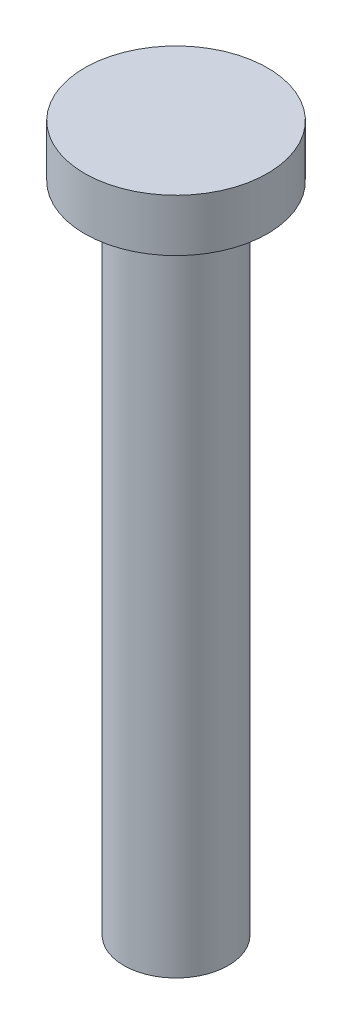
ISO-10303-21;
HEADER;
FILE_DESCRIPTION(('STEP AP214'),'2;1');
FILE_NAME('part.step','',(''),(''),'','','');
FILE_SCHEMA(('AUTOMOTIVE_DESIGN { 1 0 10303 214 1 1 1 1 }'));
ENDSEC;
DATA;
#1=APPLICATION_CONTEXT('core data for automotive mechanical design processes');
#2=APPLICATION_PROTOCOL_DEFINITION('international standard','automotive_design',2000,#1);
#3=PRODUCT_CONTEXT('',#1,'mechanical');
#4=PRODUCT('Part','Part','',(#3));
#5=PRODUCT_RELATED_PRODUCT_CATEGORY('part','',(#4));
#6=PRODUCT_DEFINITION_FORMATION('','',#4);
#7=PRODUCT_DEFINITION_CONTEXT('part definition',#1,'design');
#8=PRODUCT_DEFINITION('design','',#6,#7);
#9=PRODUCT_DEFINITION_SHAPE('','',#8);
#10=(LENGTH_UNIT() NAMED_UNIT(*) SI_UNIT(.MILLI.,.METRE.));
#11=(NAMED_UNIT(*) PLANE_ANGLE_UNIT() SI_UNIT($,.RADIAN.));
#12=(NAMED_UNIT(*) SI_UNIT($,.STERADIAN.) SOLID_ANGLE_UNIT());
#13=UNCERTAINTY_MEASURE_WITH_UNIT(LENGTH_MEASURE(1.E-05),#10,'distance_accuracy_value','');
#14=(GEOMETRIC_REPRESENTATION_CONTEXT(3) GLOBAL_UNCERTAINTY_ASSIGNED_CONTEXT((#13)) GLOBAL_UNIT_ASSIGNED_CONTEXT((#10,
#11,#12)) REPRESENTATION_CONTEXT('',''));
#15=CARTESIAN_POINT('',(0.,0.,0.));
#16=DIRECTION('',(0.,0.,1.));
#17=DIRECTION('',(1.,0.,0.));
#18=AXIS2_PLACEMENT_3D('',#15,#16,#17);
#19=CARTESIAN_POINT('',(0.,25.,0.));
#20=DIRECTION('',(0.,-1.,0.));
#21=DIRECTION('',(0.,0.,-1.));
#22=AXIS2_PLACEMENT_3D('',#19,#20,#21);
#23=CYLINDRICAL_SURFACE('',#22,2.);
#24=CARTESIAN_POINT('',(0.,25.,0.));
#25=DIRECTION('',(0.,1.,0.));
#26=DIRECTION('',(0.,0.,1.));
#27=AXIS2_PLACEMENT_3D('',#24,#25,#26);
#28=CIRCLE('',#27,2.);
#29=CARTESIAN_POINT('',(0.,25.,2.));
#30=VERTEX_POINT('',#29);
#31=EDGE_CURVE('E10',#30,#30,#28,.T.);
#32=ORIENTED_EDGE('',*,*,#31,.F.);
#33=EDGE_LOOP('',(#32));
#34=FACE_BOUND('',#33,.T.);
#35=CARTESIAN_POINT('',(0.,0.,0.));
#36=DIRECTION('',(0.,1.,0.));
#37=DIRECTION('',(0.,0.,1.));
#38=AXIS2_PLACEMENT_3D('',#35,#36,#37);
#39=CIRCLE('',#38,2.);
#40=CARTESIAN_POINT('',(0.,0.,2.));
#41=VERTEX_POINT('',#40);
#42=EDGE_CURVE('E33',#41,#41,#39,.T.);
#43=ORIENTED_EDGE('',*,*,#42,.T.);
#44=EDGE_LOOP('',(#43));
#45=FACE_BOUND('',#44,.T.);
#46=ADVANCED_FACE('F30',(#34,#45),#23,.T.);
#47=CARTESIAN_POINT('',(0.,0.,0.));
#48=DIRECTION('',(0.,1.,0.));
#49=DIRECTION('',(0.,0.,1.));
#50=AXIS2_PLACEMENT_3D('',#47,#48,#49);
#51=PLANE('',#50);
#52=ORIENTED_EDGE('',*,*,#42,.F.);
#53=EDGE_LOOP('',(#52));
#54=FACE_BOUND('',#53,.T.);
#55=ADVANCED_FACE('F58',(#54),#51,.F.);
#56=CARTESIAN_POINT('',(0.,25.,0.));
#57=DIRECTION('',(0.,1.,0.));
#58=DIRECTION('',(0.,0.,1.));
#59=AXIS2_PLACEMENT_3D('',#56,#57,#58);
#60=PLANE('',#59);
#61=CARTESIAN_POINT('',(0.,25.,0.));
#62=DIRECTION('',(0.,1.,0.));
#63=DIRECTION('',(0.,0.,1.));
#64=AXIS2_PLACEMENT_3D('',#61,#62,#63);
#65=CIRCLE('',#64,3.5);
#66=CARTESIAN_POINT('',(0.,25.,3.5));
#67=VERTEX_POINT('',#66);
#68=EDGE_CURVE('E42',#67,#67,#65,.T.);
#69=ORIENTED_EDGE('',*,*,#68,.F.);
#70=EDGE_LOOP('',(#69));
#71=FACE_BOUND('',#70,.T.);
#72=ORIENTED_EDGE('',*,*,#31,.T.);
#73=EDGE_LOOP('',(#72));
#74=FACE_BOUND('',#73,.T.);
#75=ADVANCED_FACE('F53',(#71,#74),#60,.F.);
#76=CARTESIAN_POINT('',(0.,27.,0.));
#77=DIRECTION('',(0.,-1.,0.));
#78=DIRECTION('',(0.,0.,-1.));
#79=AXIS2_PLACEMENT_3D('',#76,#77,#78);
#80=CYLINDRICAL_SURFACE('',#79,3.5);
#81=CARTESIAN_POINT('',(0.,27.,0.));
#82=DIRECTION('',(0.,1.,0.));
#83=DIRECTION('',(0.,0.,1.));
#84=AXIS2_PLACEMENT_3D('',#81,#82,#83);
#85=CIRCLE('',#84,3.5);
#86=CARTESIAN_POINT('',(0.,27.,3.5));
#87=VERTEX_POINT('',#86);
#88=EDGE_CURVE('E40',#87,#87,#85,.T.);
#89=ORIENTED_EDGE('',*,*,#88,.F.);
#90=EDGE_LOOP('',(#89));
#91=FACE_BOUND('',#90,.T.);
#92=ORIENTED_EDGE('',*,*,#68,.T.);
#93=EDGE_LOOP('',(#92));
#94=FACE_BOUND('',#93,.T.);
#95=ADVANCED_FACE('F50',(#91,#94),#80,.T.);
#96=CARTESIAN_POINT('',(0.,27.,0.));
#97=DIRECTION('',(0.,1.,0.));
#98=DIRECTION('',(0.,0.,1.));
#99=AXIS2_PLACEMENT_3D('',#96,#97,#98);
#100=PLANE('',#99);
#101=ORIENTED_EDGE('',*,*,#88,.T.);
#102=EDGE_LOOP('',(#101));
#103=FACE_BOUND('',#102,.T.);
#104=ADVANCED_FACE('F48',(#103),#100,.T.);
#105=CLOSED_SHELL('',(#46,#55,#75,#95,#104));
#106=MANIFOLD_SOLID_BREP('B2',#105);
#107=ADVANCED_BREP_SHAPE_REPRESENTATION('',(#18,#106),#14);
#108=SHAPE_DEFINITION_REPRESENTATION(#9,#107);
ENDSEC;
END-ISO-10303-21;
